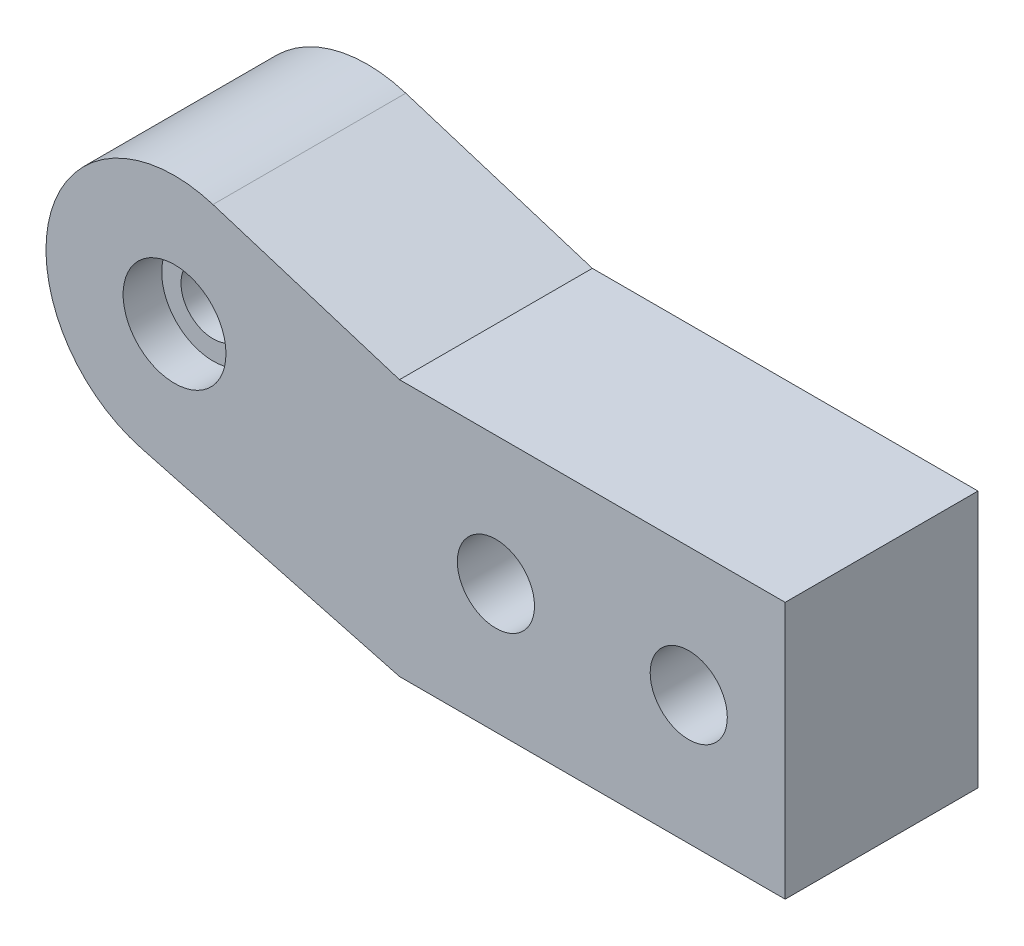
ISO-10303-21;
HEADER;
FILE_DESCRIPTION(('STEP AP214'),'2;1');
FILE_NAME('part.step','',(''),(''),'','','');
FILE_SCHEMA(('AUTOMOTIVE_DESIGN { 1 0 10303 214 1 1 1 1 }'));
ENDSEC;
DATA;
#1=APPLICATION_CONTEXT('core data for automotive mechanical design processes');
#2=APPLICATION_PROTOCOL_DEFINITION('international standard','automotive_design',2000,#1);
#3=PRODUCT_CONTEXT('',#1,'mechanical');
#4=PRODUCT('Part','Part','',(#3));
#5=PRODUCT_RELATED_PRODUCT_CATEGORY('part','',(#4));
#6=PRODUCT_DEFINITION_FORMATION('','',#4);
#7=PRODUCT_DEFINITION_CONTEXT('part definition',#1,'design');
#8=PRODUCT_DEFINITION('design','',#6,#7);
#9=PRODUCT_DEFINITION_SHAPE('','',#8);
#10=(LENGTH_UNIT() NAMED_UNIT(*) SI_UNIT(.MILLI.,.METRE.));
#11=(NAMED_UNIT(*) PLANE_ANGLE_UNIT() SI_UNIT($,.RADIAN.));
#12=(NAMED_UNIT(*) SI_UNIT($,.STERADIAN.) SOLID_ANGLE_UNIT());
#13=UNCERTAINTY_MEASURE_WITH_UNIT(LENGTH_MEASURE(1.E-05),#10,'distance_accuracy_value','');
#14=(GEOMETRIC_REPRESENTATION_CONTEXT(3) GLOBAL_UNCERTAINTY_ASSIGNED_CONTEXT((#13)) GLOBAL_UNIT_ASSIGNED_CONTEXT((#10,
#11,#12)) REPRESENTATION_CONTEXT('',''));
#15=CARTESIAN_POINT('',(0.,0.,0.));
#16=DIRECTION('',(0.,0.,1.));
#17=DIRECTION('',(1.,0.,0.));
#18=AXIS2_PLACEMENT_3D('',#15,#16,#17);
#19=CARTESIAN_POINT('',(-22.5,-10.,15.));
#20=DIRECTION('',(0.,0.,-1.));
#21=DIRECTION('',(-1.,0.,0.));
#22=AXIS2_PLACEMENT_3D('',#19,#20,#21);
#23=CYLINDRICAL_SURFACE('',#22,3.);
#24=CARTESIAN_POINT('',(-22.5,-10.,15.));
#25=DIRECTION('',(0.,0.,1.));
#26=DIRECTION('',(1.,0.,0.));
#27=AXIS2_PLACEMENT_3D('',#24,#25,#26);
#28=CIRCLE('',#27,3.);
#29=CARTESIAN_POINT('',(-19.5,-10.,15.));
#30=VERTEX_POINT('',#29);
#31=EDGE_CURVE('E133',#30,#30,#28,.T.);
#32=ORIENTED_EDGE('',*,*,#31,.T.);
#33=EDGE_LOOP('',(#32));
#34=FACE_BOUND('',#33,.T.);
#35=CARTESIAN_POINT('',(-22.5,-10.,6.));
#36=DIRECTION('',(0.,0.,-1.));
#37=DIRECTION('',(-1.,0.,0.));
#38=AXIS2_PLACEMENT_3D('',#35,#36,#37);
#39=CIRCLE('',#38,3.);
#40=CARTESIAN_POINT('',(-25.5,-10.,6.));
#41=VERTEX_POINT('',#40);
#42=EDGE_CURVE('E45',#41,#41,#39,.T.);
#43=ORIENTED_EDGE('',*,*,#42,.T.);
#44=EDGE_LOOP('',(#43));
#45=FACE_BOUND('',#44,.T.);
#46=ADVANCED_FACE('F41',(#34,#45),#23,.F.);
#47=CARTESIAN_POINT('',(-7.5,-10.,15.));
#48=DIRECTION('',(0.,0.,-1.));
#49=DIRECTION('',(-1.,0.,0.));
#50=AXIS2_PLACEMENT_3D('',#47,#48,#49);
#51=CYLINDRICAL_SURFACE('',#50,3.00000000000001);
#52=CARTESIAN_POINT('',(-7.5,-10.,15.));
#53=DIRECTION('',(0.,0.,1.));
#54=DIRECTION('',(1.,0.,0.));
#55=AXIS2_PLACEMENT_3D('',#52,#53,#54);
#56=CIRCLE('',#55,3.00000000000001);
#57=CARTESIAN_POINT('',(-4.49999999999999,-10.,15.));
#58=VERTEX_POINT('',#57);
#59=EDGE_CURVE('E151',#58,#58,#56,.T.);
#60=ORIENTED_EDGE('',*,*,#59,.T.);
#61=EDGE_LOOP('',(#60));
#62=FACE_BOUND('',#61,.T.);
#63=CARTESIAN_POINT('',(-7.5,-10.,6.));
#64=DIRECTION('',(0.,0.,-1.));
#65=DIRECTION('',(-1.,0.,0.));
#66=AXIS2_PLACEMENT_3D('',#63,#64,#65);
#67=CIRCLE('',#66,3.00000000000001);
#68=CARTESIAN_POINT('',(-10.5,-10.,6.));
#69=VERTEX_POINT('',#68);
#70=EDGE_CURVE('E145',#69,#69,#67,.T.);
#71=ORIENTED_EDGE('',*,*,#70,.T.);
#72=EDGE_LOOP('',(#71));
#73=FACE_BOUND('',#72,.T.);
#74=ADVANCED_FACE('F199',(#62,#73),#51,.F.);
#75=CARTESIAN_POINT('',(-47.5,-5.00000000000001,15.));
#76=DIRECTION('',(0.,0.,1.));
#77=DIRECTION('',(1.,0.,0.));
#78=AXIS2_PLACEMENT_3D('',#75,#76,#77);
#79=PLANE('',#78);
#80=CARTESIAN_POINT('',(-47.5,-5.00000000000001,15.));
#81=DIRECTION('',(0.,0.,1.));
#82=DIRECTION('',(1.,0.,0.));
#83=AXIS2_PLACEMENT_3D('',#80,#81,#82);
#84=CIRCLE('',#83,4.00000000000001);
#85=CARTESIAN_POINT('',(-43.5,-5.00000000000001,15.));
#86=VERTEX_POINT('',#85);
#87=EDGE_CURVE('E161',#86,#86,#84,.T.);
#88=ORIENTED_EDGE('',*,*,#87,.F.);
#89=EDGE_LOOP('',(#88));
#90=FACE_BOUND('',#89,.T.);
#91=ORIENTED_EDGE('',*,*,#31,.F.);
#92=EDGE_LOOP('',(#91));
#93=FACE_BOUND('',#92,.T.);
#94=DIRECTION('',(-0.954327126643161,0.298763678101954,0.));
#95=VECTOR('',#94,1.);
#96=CARTESIAN_POINT('',(-30.,0.,15.));
#97=LINE('',#96,#95);
#98=CARTESIAN_POINT('',(-30.,0.,15.));
#99=VERTEX_POINT('',#98);
#100=CARTESIAN_POINT('',(-44.5123632189805,4.54327126643161,15.));
#101=VERTEX_POINT('',#100);
#102=EDGE_CURVE('E140',#99,#101,#97,.T.);
#103=ORIENTED_EDGE('',*,*,#102,.T.);
#104=CARTESIAN_POINT('',(-47.5,-5.00000000000001,15.));
#105=DIRECTION('',(0.,0.,1.));
#106=DIRECTION('',(1.,0.,0.));
#107=AXIS2_PLACEMENT_3D('',#104,#105,#106);
#108=CIRCLE('',#107,10.);
#109=CARTESIAN_POINT('',(-50.0693815502951,-14.6642784753443,15.));
#110=VERTEX_POINT('',#109);
#111=EDGE_CURVE('E97',#101,#110,#108,.T.);
#112=ORIENTED_EDGE('',*,*,#111,.T.);
#113=DIRECTION('',(0.96642784753443,-0.256938155029511,0.));
#114=VECTOR('',#113,1.);
#115=CARTESIAN_POINT('',(-30.,-20.,15.));
#116=LINE('',#115,#114);
#117=CARTESIAN_POINT('',(-30.,-20.,15.));
#118=VERTEX_POINT('',#117);
#119=EDGE_CURVE('E111',#110,#118,#116,.T.);
#120=ORIENTED_EDGE('',*,*,#119,.T.);
#121=DIRECTION('',(1.,0.,0.));
#122=VECTOR('',#121,1.);
#123=CARTESIAN_POINT('',(0.,-20.,15.));
#124=LINE('',#123,#122);
#125=CARTESIAN_POINT('',(0.,-20.,15.));
#126=VERTEX_POINT('',#125);
#127=EDGE_CURVE('E104',#118,#126,#124,.T.);
#128=ORIENTED_EDGE('',*,*,#127,.T.);
#129=DIRECTION('',(0.,1.,0.));
#130=VECTOR('',#129,1.);
#131=CARTESIAN_POINT('',(0.,0.,15.));
#132=LINE('',#131,#130);
#133=CARTESIAN_POINT('',(0.,0.,15.));
#134=VERTEX_POINT('',#133);
#135=EDGE_CURVE('E109',#126,#134,#132,.T.);
#136=ORIENTED_EDGE('',*,*,#135,.T.);
#137=DIRECTION('',(-1.,0.,0.));
#138=VECTOR('',#137,1.);
#139=CARTESIAN_POINT('',(-30.,0.,15.));
#140=LINE('',#139,#138);
#141=EDGE_CURVE('E60',#134,#99,#140,.T.);
#142=ORIENTED_EDGE('',*,*,#141,.T.);
#143=EDGE_LOOP('',(#103,#112,#120,#128,#136,#142));
#144=FACE_BOUND('',#143,.T.);
#145=ORIENTED_EDGE('',*,*,#59,.F.);
#146=EDGE_LOOP('',(#145));
#147=FACE_BOUND('',#146,.T.);
#148=ADVANCED_FACE('F106',(#90,#93,#144,#147),#79,.T.);
#149=CARTESIAN_POINT('',(-47.5,-5.00000000000001,0.));
#150=DIRECTION('',(0.,0.,1.));
#151=DIRECTION('',(1.,0.,0.));
#152=AXIS2_PLACEMENT_3D('',#149,#150,#151);
#153=PLANE('',#152);
#154=CARTESIAN_POINT('',(-7.5,-10.,0.));
#155=DIRECTION('',(0.,0.,-1.));
#156=DIRECTION('',(-1.,0.,0.));
#157=AXIS2_PLACEMENT_3D('',#154,#155,#156);
#158=CIRCLE('',#157,5.);
#159=CARTESIAN_POINT('',(-12.5,-10.,0.));
#160=VERTEX_POINT('',#159);
#161=EDGE_CURVE('E153',#160,#160,#158,.T.);
#162=ORIENTED_EDGE('',*,*,#161,.F.);
#163=EDGE_LOOP('',(#162));
#164=FACE_BOUND('',#163,.T.);
#165=CARTESIAN_POINT('',(-22.5,-10.,0.));
#166=DIRECTION('',(0.,0.,-1.));
#167=DIRECTION('',(-1.,0.,0.));
#168=AXIS2_PLACEMENT_3D('',#165,#166,#167);
#169=CIRCLE('',#168,5.);
#170=CARTESIAN_POINT('',(-27.5,-10.,0.));
#171=VERTEX_POINT('',#170);
#172=EDGE_CURVE('E158',#171,#171,#169,.T.);
#173=ORIENTED_EDGE('',*,*,#172,.F.);
#174=EDGE_LOOP('',(#173));
#175=FACE_BOUND('',#174,.T.);
#176=DIRECTION('',(-0.954327126643161,0.298763678101954,0.));
#177=VECTOR('',#176,1.);
#178=CARTESIAN_POINT('',(-30.,0.,0.));
#179=LINE('',#178,#177);
#180=CARTESIAN_POINT('',(-30.,0.,0.));
#181=VERTEX_POINT('',#180);
#182=CARTESIAN_POINT('',(-44.5123632189805,4.54327126643161,0.));
#183=VERTEX_POINT('',#182);
#184=EDGE_CURVE('E129',#181,#183,#179,.T.);
#185=ORIENTED_EDGE('',*,*,#184,.F.);
#186=DIRECTION('',(-1.,0.,0.));
#187=VECTOR('',#186,1.);
#188=CARTESIAN_POINT('',(-30.,0.,0.));
#189=LINE('',#188,#187);
#190=CARTESIAN_POINT('',(0.,0.,0.));
#191=VERTEX_POINT('',#190);
#192=EDGE_CURVE('E89',#191,#181,#189,.T.);
#193=ORIENTED_EDGE('',*,*,#192,.F.);
#194=DIRECTION('',(0.,1.,0.));
#195=VECTOR('',#194,1.);
#196=CARTESIAN_POINT('',(0.,0.,0.));
#197=LINE('',#196,#195);
#198=CARTESIAN_POINT('',(0.,-20.,0.));
#199=VERTEX_POINT('',#198);
#200=EDGE_CURVE('E83',#199,#191,#197,.T.);
#201=ORIENTED_EDGE('',*,*,#200,.F.);
#202=DIRECTION('',(1.,0.,0.));
#203=VECTOR('',#202,1.);
#204=CARTESIAN_POINT('',(0.,-20.,0.));
#205=LINE('',#204,#203);
#206=CARTESIAN_POINT('',(-30.,-20.,0.));
#207=VERTEX_POINT('',#206);
#208=EDGE_CURVE('E119',#207,#199,#205,.T.);
#209=ORIENTED_EDGE('',*,*,#208,.F.);
#210=DIRECTION('',(0.96642784753443,-0.256938155029511,0.));
#211=VECTOR('',#210,1.);
#212=CARTESIAN_POINT('',(-30.,-20.,0.));
#213=LINE('',#212,#211);
#214=CARTESIAN_POINT('',(-50.0693815502951,-14.6642784753443,0.));
#215=VERTEX_POINT('',#214);
#216=EDGE_CURVE('E135',#215,#207,#213,.T.);
#217=ORIENTED_EDGE('',*,*,#216,.F.);
#218=CARTESIAN_POINT('',(-47.5,-5.00000000000001,0.));
#219=DIRECTION('',(0.,0.,1.));
#220=DIRECTION('',(1.,0.,0.));
#221=AXIS2_PLACEMENT_3D('',#218,#219,#220);
#222=CIRCLE('',#221,10.);
#223=EDGE_CURVE('E132',#183,#215,#222,.T.);
#224=ORIENTED_EDGE('',*,*,#223,.F.);
#225=EDGE_LOOP('',(#185,#193,#201,#209,#217,#224));
#226=FACE_BOUND('',#225,.T.);
#227=ADVANCED_FACE('F183',(#164,#175,#226),#153,.F.);
#228=CARTESIAN_POINT('',(-30.,0.,15.));
#229=DIRECTION('',(-0.298763678101954,-0.954327126643161,0.));
#230=DIRECTION('',(0.954327126643161,-0.298763678101954,0.));
#231=AXIS2_PLACEMENT_3D('',#228,#229,#230);
#232=PLANE('',#231);
#233=ORIENTED_EDGE('',*,*,#184,.T.);
#234=DIRECTION('',(0.,0.,-1.));
#235=VECTOR('',#234,1.);
#236=CARTESIAN_POINT('',(-44.5123632189805,4.54327126643161,15.));
#237=LINE('',#236,#235);
#238=EDGE_CURVE('E11',#101,#183,#237,.T.);
#239=ORIENTED_EDGE('',*,*,#238,.F.);
#240=ORIENTED_EDGE('',*,*,#102,.F.);
#241=DIRECTION('',(0.,0.,-1.));
#242=VECTOR('',#241,1.);
#243=CARTESIAN_POINT('',(-30.,0.,15.));
#244=LINE('',#243,#242);
#245=EDGE_CURVE('E125',#99,#181,#244,.T.);
#246=ORIENTED_EDGE('',*,*,#245,.T.);
#247=EDGE_LOOP('',(#233,#239,#240,#246));
#248=FACE_BOUND('',#247,.T.);
#249=ADVANCED_FACE('F43',(#248),#232,.F.);
#250=CARTESIAN_POINT('',(-47.5,-5.00000000000001,15.));
#251=DIRECTION('',(0.,0.,-1.));
#252=DIRECTION('',(-1.,0.,0.));
#253=AXIS2_PLACEMENT_3D('',#250,#251,#252);
#254=CYLINDRICAL_SURFACE('',#253,10.);
#255=ORIENTED_EDGE('',*,*,#223,.T.);
#256=DIRECTION('',(0.,0.,-1.));
#257=VECTOR('',#256,1.);
#258=CARTESIAN_POINT('',(-50.0693815502951,-14.6642784753443,15.));
#259=LINE('',#258,#257);
#260=EDGE_CURVE('E51',#110,#215,#259,.T.);
#261=ORIENTED_EDGE('',*,*,#260,.F.);
#262=ORIENTED_EDGE('',*,*,#111,.F.);
#263=ORIENTED_EDGE('',*,*,#238,.T.);
#264=EDGE_LOOP('',(#255,#261,#262,#263));
#265=FACE_BOUND('',#264,.T.);
#266=ADVANCED_FACE('F177',(#265),#254,.T.);
#267=CARTESIAN_POINT('',(-30.,-20.,15.));
#268=DIRECTION('',(0.256938155029511,0.96642784753443,0.));
#269=DIRECTION('',(-0.96642784753443,0.256938155029511,0.));
#270=AXIS2_PLACEMENT_3D('',#267,#268,#269);
#271=PLANE('',#270);
#272=ORIENTED_EDGE('',*,*,#216,.T.);
#273=DIRECTION('',(0.,0.,-1.));
#274=VECTOR('',#273,1.);
#275=CARTESIAN_POINT('',(-30.,-20.,15.));
#276=LINE('',#275,#274);
#277=EDGE_CURVE('E120',#118,#207,#276,.T.);
#278=ORIENTED_EDGE('',*,*,#277,.F.);
#279=ORIENTED_EDGE('',*,*,#119,.F.);
#280=ORIENTED_EDGE('',*,*,#260,.T.);
#281=EDGE_LOOP('',(#272,#278,#279,#280));
#282=FACE_BOUND('',#281,.T.);
#283=ADVANCED_FACE('F180',(#282),#271,.F.);
#284=CARTESIAN_POINT('',(0.,-20.,15.));
#285=DIRECTION('',(0.,1.,0.));
#286=DIRECTION('',(-1.,0.,0.));
#287=AXIS2_PLACEMENT_3D('',#284,#285,#286);
#288=PLANE('',#287);
#289=ORIENTED_EDGE('',*,*,#208,.T.);
#290=DIRECTION('',(0.,0.,-1.));
#291=VECTOR('',#290,1.);
#292=CARTESIAN_POINT('',(0.,-20.,15.));
#293=LINE('',#292,#291);
#294=EDGE_CURVE('E116',#126,#199,#293,.T.);
#295=ORIENTED_EDGE('',*,*,#294,.F.);
#296=ORIENTED_EDGE('',*,*,#127,.F.);
#297=ORIENTED_EDGE('',*,*,#277,.T.);
#298=EDGE_LOOP('',(#289,#295,#296,#297));
#299=FACE_BOUND('',#298,.T.);
#300=ADVANCED_FACE('F117',(#299),#288,.F.);
#301=CARTESIAN_POINT('',(0.,0.,15.));
#302=DIRECTION('',(-1.,0.,0.));
#303=DIRECTION('',(0.,0.,1.));
#304=AXIS2_PLACEMENT_3D('',#301,#302,#303);
#305=PLANE('',#304);
#306=ORIENTED_EDGE('',*,*,#200,.T.);
#307=DIRECTION('',(0.,0.,-1.));
#308=VECTOR('',#307,1.);
#309=CARTESIAN_POINT('',(0.,0.,15.));
#310=LINE('',#309,#308);
#311=EDGE_CURVE('E121',#134,#191,#310,.T.);
#312=ORIENTED_EDGE('',*,*,#311,.F.);
#313=ORIENTED_EDGE('',*,*,#135,.F.);
#314=ORIENTED_EDGE('',*,*,#294,.T.);
#315=EDGE_LOOP('',(#306,#312,#313,#314));
#316=FACE_BOUND('',#315,.T.);
#317=ADVANCED_FACE('F123',(#316),#305,.F.);
#318=CARTESIAN_POINT('',(-30.,0.,15.));
#319=DIRECTION('',(0.,-1.,0.));
#320=DIRECTION('',(0.,0.,-1.));
#321=AXIS2_PLACEMENT_3D('',#318,#319,#320);
#322=PLANE('',#321);
#323=ORIENTED_EDGE('',*,*,#192,.T.);
#324=ORIENTED_EDGE('',*,*,#245,.F.);
#325=ORIENTED_EDGE('',*,*,#141,.F.);
#326=ORIENTED_EDGE('',*,*,#311,.T.);
#327=EDGE_LOOP('',(#323,#324,#325,#326));
#328=FACE_BOUND('',#327,.T.);
#329=ADVANCED_FACE('F185',(#328),#322,.F.);
#330=CARTESIAN_POINT('',(-7.5,-10.,6.));
#331=DIRECTION('',(0.,0.,-1.));
#332=DIRECTION('',(-1.,0.,0.));
#333=AXIS2_PLACEMENT_3D('',#330,#331,#332);
#334=CYLINDRICAL_SURFACE('',#333,5.);
#335=CARTESIAN_POINT('',(-7.5,-10.,6.));
#336=DIRECTION('',(0.,0.,-1.));
#337=DIRECTION('',(-1.,0.,0.));
#338=AXIS2_PLACEMENT_3D('',#335,#336,#337);
#339=CIRCLE('',#338,5.);
#340=CARTESIAN_POINT('',(-12.5,-10.,6.));
#341=VERTEX_POINT('',#340);
#342=EDGE_CURVE('E147',#341,#341,#339,.T.);
#343=ORIENTED_EDGE('',*,*,#342,.F.);
#344=EDGE_LOOP('',(#343));
#345=FACE_BOUND('',#344,.T.);
#346=ORIENTED_EDGE('',*,*,#161,.T.);
#347=EDGE_LOOP('',(#346));
#348=FACE_BOUND('',#347,.T.);
#349=ADVANCED_FACE('F187',(#345,#348),#334,.F.);
#350=CARTESIAN_POINT('',(-7.5,-10.,6.));
#351=DIRECTION('',(0.,0.,-1.));
#352=DIRECTION('',(-1.,0.,0.));
#353=AXIS2_PLACEMENT_3D('',#350,#351,#352);
#354=PLANE('',#353);
#355=ORIENTED_EDGE('',*,*,#70,.F.);
#356=EDGE_LOOP('',(#355));
#357=FACE_BOUND('',#356,.T.);
#358=ORIENTED_EDGE('',*,*,#342,.T.);
#359=EDGE_LOOP('',(#358));
#360=FACE_BOUND('',#359,.T.);
#361=ADVANCED_FACE('F194',(#357,#360),#354,.T.);
#362=CARTESIAN_POINT('',(-22.5,-10.,6.));
#363=DIRECTION('',(0.,0.,-1.));
#364=DIRECTION('',(-1.,0.,0.));
#365=AXIS2_PLACEMENT_3D('',#362,#363,#364);
#366=CYLINDRICAL_SURFACE('',#365,5.);
#367=CARTESIAN_POINT('',(-22.5,-10.,6.));
#368=DIRECTION('',(0.,0.,-1.));
#369=DIRECTION('',(-1.,0.,0.));
#370=AXIS2_PLACEMENT_3D('',#367,#368,#369);
#371=CIRCLE('',#370,5.);
#372=CARTESIAN_POINT('',(-27.5,-10.,6.));
#373=VERTEX_POINT('',#372);
#374=EDGE_CURVE('E166',#373,#373,#371,.T.);
#375=ORIENTED_EDGE('',*,*,#374,.F.);
#376=EDGE_LOOP('',(#375));
#377=FACE_BOUND('',#376,.T.);
#378=ORIENTED_EDGE('',*,*,#172,.T.);
#379=EDGE_LOOP('',(#378));
#380=FACE_BOUND('',#379,.T.);
#381=ADVANCED_FACE('F221',(#377,#380),#366,.F.);
#382=CARTESIAN_POINT('',(-22.5,-10.,6.));
#383=DIRECTION('',(0.,0.,-1.));
#384=DIRECTION('',(-1.,0.,0.));
#385=AXIS2_PLACEMENT_3D('',#382,#383,#384);
#386=PLANE('',#385);
#387=ORIENTED_EDGE('',*,*,#42,.F.);
#388=EDGE_LOOP('',(#387));
#389=FACE_BOUND('',#388,.T.);
#390=ORIENTED_EDGE('',*,*,#374,.T.);
#391=EDGE_LOOP('',(#390));
#392=FACE_BOUND('',#391,.T.);
#393=ADVANCED_FACE('F223',(#389,#392),#386,.T.);
#394=CARTESIAN_POINT('',(-47.5,-5.00000000000001,12.));
#395=DIRECTION('',(0.,0.,1.));
#396=DIRECTION('',(1.,0.,0.));
#397=AXIS2_PLACEMENT_3D('',#394,#395,#396);
#398=CYLINDRICAL_SURFACE('',#397,4.00000000000001);
#399=CARTESIAN_POINT('',(-47.5,-5.00000000000001,12.));
#400=DIRECTION('',(0.,0.,1.));
#401=DIRECTION('',(1.,0.,0.));
#402=AXIS2_PLACEMENT_3D('',#399,#400,#401);
#403=CIRCLE('',#402,4.00000000000001);
#404=CARTESIAN_POINT('',(-43.5,-5.00000000000001,12.));
#405=VERTEX_POINT('',#404);
#406=EDGE_CURVE('E169',#405,#405,#403,.T.);
#407=ORIENTED_EDGE('',*,*,#406,.F.);
#408=EDGE_LOOP('',(#407));
#409=FACE_BOUND('',#408,.T.);
#410=ORIENTED_EDGE('',*,*,#87,.T.);
#411=EDGE_LOOP('',(#410));
#412=FACE_BOUND('',#411,.T.);
#413=ADVANCED_FACE('F230',(#409,#412),#398,.F.);
#414=CARTESIAN_POINT('',(-47.5,-5.00000000000001,12.));
#415=DIRECTION('',(0.,0.,1.));
#416=DIRECTION('',(1.,0.,0.));
#417=AXIS2_PLACEMENT_3D('',#414,#415,#416);
#418=PLANE('',#417);
#419=CARTESIAN_POINT('',(-47.5,-5.00000000000001,12.));
#420=DIRECTION('',(0.,0.,1.));
#421=DIRECTION('',(1.,0.,0.));
#422=AXIS2_PLACEMENT_3D('',#419,#420,#421);
#423=CIRCLE('',#422,2.5);
#424=CARTESIAN_POINT('',(-45.,-5.00000000000001,12.));
#425=VERTEX_POINT('',#424);
#426=EDGE_CURVE('E255',#425,#425,#423,.T.);
#427=ORIENTED_EDGE('',*,*,#426,.F.);
#428=EDGE_LOOP('',(#427));
#429=FACE_BOUND('',#428,.T.);
#430=ORIENTED_EDGE('',*,*,#406,.T.);
#431=EDGE_LOOP('',(#430));
#432=FACE_BOUND('',#431,.T.);
#433=ADVANCED_FACE('F238',(#429,#432),#418,.T.);
#434=CARTESIAN_POINT('',(-47.5,-5.00000000000001,2.));
#435=DIRECTION('',(0.,0.,1.));
#436=DIRECTION('',(1.,0.,0.));
#437=AXIS2_PLACEMENT_3D('',#434,#435,#436);
#438=CYLINDRICAL_SURFACE('',#437,2.5);
#439=CARTESIAN_POINT('',(-47.5,-5.00000000000001,2.));
#440=DIRECTION('',(0.,0.,1.));
#441=DIRECTION('',(1.,0.,0.));
#442=AXIS2_PLACEMENT_3D('',#439,#440,#441);
#443=CIRCLE('',#442,2.5);
#444=CARTESIAN_POINT('',(-45.,-5.00000000000001,2.));
#445=VERTEX_POINT('',#444);
#446=EDGE_CURVE('E254',#445,#445,#443,.T.);
#447=ORIENTED_EDGE('',*,*,#446,.F.);
#448=EDGE_LOOP('',(#447));
#449=FACE_BOUND('',#448,.T.);
#450=ORIENTED_EDGE('',*,*,#426,.T.);
#451=EDGE_LOOP('',(#450));
#452=FACE_BOUND('',#451,.T.);
#453=ADVANCED_FACE('F242',(#449,#452),#438,.F.);
#454=CARTESIAN_POINT('',(-47.5,-5.00000000000001,2.));
#455=DIRECTION('',(0.,0.,1.));
#456=DIRECTION('',(1.,0.,0.));
#457=AXIS2_PLACEMENT_3D('',#454,#455,#456);
#458=PLANE('',#457);
#459=ORIENTED_EDGE('',*,*,#446,.T.);
#460=EDGE_LOOP('',(#459));
#461=FACE_BOUND('',#460,.T.);
#462=ADVANCED_FACE('F246',(#461),#458,.T.);
#463=CLOSED_SHELL('',(#46,#74,#148,#227,#249,#266,#283,#300,#317,#329,#349,#361,#381,#393,#413,
#433,#453,#462));
#464=MANIFOLD_SOLID_BREP('B2',#463);
#465=ADVANCED_BREP_SHAPE_REPRESENTATION('',(#18,#464),#14);
#466=SHAPE_DEFINITION_REPRESENTATION(#9,#465);
ENDSEC;
END-ISO-10303-21;
